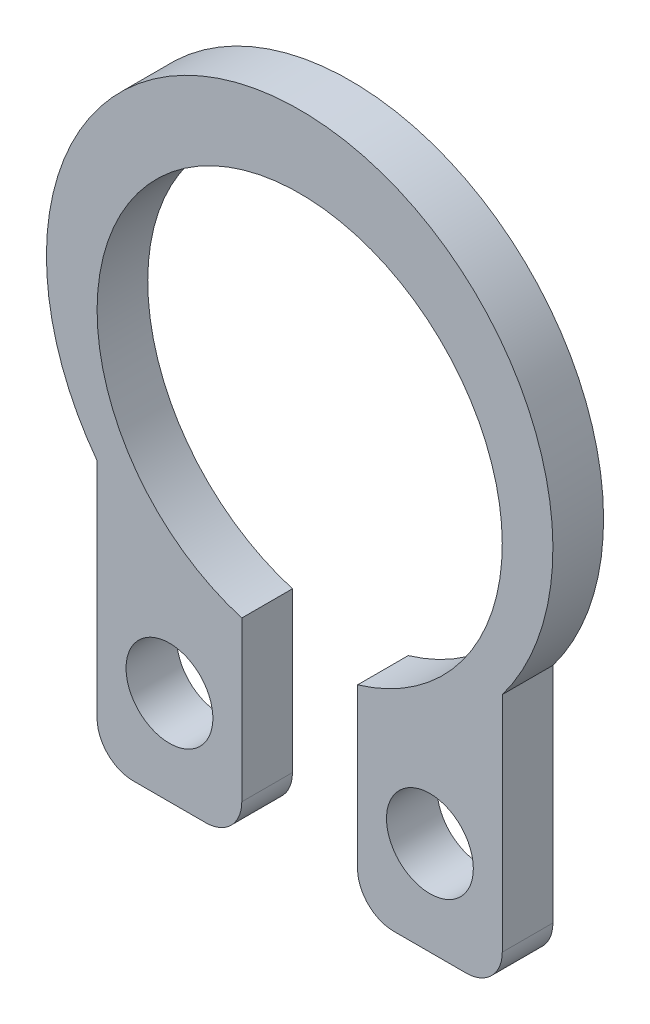
ISO-10303-21;
HEADER;
FILE_DESCRIPTION(('STEP AP214'),'2;1');
FILE_NAME('part.step','',(''),(''),'','','');
FILE_SCHEMA(('AUTOMOTIVE_DESIGN { 1 0 10303 214 1 1 1 1 }'));
ENDSEC;
DATA;
#1=APPLICATION_CONTEXT('core data for automotive mechanical design processes');
#2=APPLICATION_PROTOCOL_DEFINITION('international standard','automotive_design',2000,#1);
#3=PRODUCT_CONTEXT('',#1,'mechanical');
#4=PRODUCT('Part','Part','',(#3));
#5=PRODUCT_RELATED_PRODUCT_CATEGORY('part','',(#4));
#6=PRODUCT_DEFINITION_FORMATION('','',#4);
#7=PRODUCT_DEFINITION_CONTEXT('part definition',#1,'design');
#8=PRODUCT_DEFINITION('design','',#6,#7);
#9=PRODUCT_DEFINITION_SHAPE('','',#8);
#10=(LENGTH_UNIT() NAMED_UNIT(*) SI_UNIT(.MILLI.,.METRE.));
#11=(NAMED_UNIT(*) PLANE_ANGLE_UNIT() SI_UNIT($,.RADIAN.));
#12=(NAMED_UNIT(*) SI_UNIT($,.STERADIAN.) SOLID_ANGLE_UNIT());
#13=UNCERTAINTY_MEASURE_WITH_UNIT(LENGTH_MEASURE(1.E-05),#10,'distance_accuracy_value','');
#14=(GEOMETRIC_REPRESENTATION_CONTEXT(3) GLOBAL_UNCERTAINTY_ASSIGNED_CONTEXT((#13)) GLOBAL_UNIT_ASSIGNED_CONTEXT((#10,
#11,#12)) REPRESENTATION_CONTEXT('',''));
#15=CARTESIAN_POINT('',(0.,0.,0.));
#16=DIRECTION('',(0.,0.,1.));
#17=DIRECTION('',(1.,0.,0.));
#18=AXIS2_PLACEMENT_3D('',#15,#16,#17);
#19=CARTESIAN_POINT('',(0.,0.3,0.7));
#20=DIRECTION('',(0.,0.,1.));
#21=DIRECTION('',(1.,0.,0.));
#22=AXIS2_PLACEMENT_3D('',#19,#20,#21);
#23=PLANE('',#22);
#24=CARTESIAN_POINT('',(1.8,-4.08328157299975,0.7));
#25=DIRECTION('',(0.,0.,1.));
#26=DIRECTION('',(1.,0.,0.));
#27=AXIS2_PLACEMENT_3D('',#24,#25,#26);
#28=CIRCLE('',#27,0.6);
#29=CARTESIAN_POINT('',(2.4,-4.08328157299975,0.7));
#30=VERTEX_POINT('',#29);
#31=EDGE_CURVE('E158',#30,#30,#28,.T.);
#32=ORIENTED_EDGE('',*,*,#31,.F.);
#33=EDGE_LOOP('',(#32));
#34=FACE_BOUND('',#33,.T.);
#35=CARTESIAN_POINT('',(0.,0.3,0.7));
#36=DIRECTION('',(0.,0.,1.));
#37=DIRECTION('',(1.,0.,0.));
#38=AXIS2_PLACEMENT_3D('',#35,#36,#37);
#39=CIRCLE('',#38,3.5);
#40=CARTESIAN_POINT('',(2.8,-1.8,0.7));
#41=VERTEX_POINT('',#40);
#42=CARTESIAN_POINT('',(-2.8,-1.8,0.7));
#43=VERTEX_POINT('',#42);
#44=EDGE_CURVE('E177',#41,#43,#39,.T.);
#45=ORIENTED_EDGE('',*,*,#44,.T.);
#46=DIRECTION('',(0.,-1.,0.));
#47=VECTOR('',#46,1.);
#48=CARTESIAN_POINT('',(-2.8,-4.88328157299975,0.7));
#49=LINE('',#48,#47);
#50=CARTESIAN_POINT('',(-2.8,-4.88328157299975,0.7));
#51=VERTEX_POINT('',#50);
#52=EDGE_CURVE('E105',#43,#51,#49,.T.);
#53=ORIENTED_EDGE('',*,*,#52,.T.);
#54=CARTESIAN_POINT('',(-2.3,-4.88328157299975,0.7));
#55=DIRECTION('',(0.,0.,1.));
#56=DIRECTION('',(-1.,0.,0.));
#57=AXIS2_PLACEMENT_3D('',#54,#55,#56);
#58=CIRCLE('',#57,0.500000000000001);
#59=CARTESIAN_POINT('',(-2.3,-5.38328157299975,0.7));
#60=VERTEX_POINT('',#59);
#61=EDGE_CURVE('E204',#51,#60,#58,.T.);
#62=ORIENTED_EDGE('',*,*,#61,.T.);
#63=DIRECTION('',(1.,0.,0.));
#64=VECTOR('',#63,1.);
#65=CARTESIAN_POINT('',(-1.3,-5.38328157299975,0.7));
#66=LINE('',#65,#64);
#67=CARTESIAN_POINT('',(-1.3,-5.38328157299975,0.7));
#68=VERTEX_POINT('',#67);
#69=EDGE_CURVE('E223',#60,#68,#66,.T.);
#70=ORIENTED_EDGE('',*,*,#69,.T.);
#71=CARTESIAN_POINT('',(-1.3,-4.88328157299975,0.7));
#72=DIRECTION('',(0.,0.,1.));
#73=DIRECTION('',(-1.,0.,0.));
#74=AXIS2_PLACEMENT_3D('',#71,#72,#73);
#75=CIRCLE('',#74,0.500000000000001);
#76=CARTESIAN_POINT('',(-0.800000000000001,-4.88328157299975,0.7));
#77=VERTEX_POINT('',#76);
#78=EDGE_CURVE('E220',#68,#77,#75,.T.);
#79=ORIENTED_EDGE('',*,*,#78,.T.);
#80=DIRECTION('',(0.,1.,0.));
#81=VECTOR('',#80,1.);
#82=CARTESIAN_POINT('',(-0.8,-2.68328157299975,0.7));
#83=LINE('',#82,#81);
#84=CARTESIAN_POINT('',(-0.800000000000001,-2.68328157299975,0.7));
#85=VERTEX_POINT('',#84);
#86=EDGE_CURVE('E222',#77,#85,#83,.T.);
#87=ORIENTED_EDGE('',*,*,#86,.T.);
#88=CARTESIAN_POINT('',(0.,0.,0.7));
#89=DIRECTION('',(0.,0.,-1.));
#90=DIRECTION('',(1.,0.,0.));
#91=AXIS2_PLACEMENT_3D('',#88,#89,#90);
#92=CIRCLE('',#91,2.8);
#93=CARTESIAN_POINT('',(0.8,-2.68328157299975,0.7));
#94=VERTEX_POINT('',#93);
#95=EDGE_CURVE('E225',#85,#94,#92,.T.);
#96=ORIENTED_EDGE('',*,*,#95,.T.);
#97=DIRECTION('',(0.,-1.,0.));
#98=VECTOR('',#97,1.);
#99=CARTESIAN_POINT('',(0.8,-2.68328157299975,0.7));
#100=LINE('',#99,#98);
#101=CARTESIAN_POINT('',(0.8,-4.88328157299975,0.7));
#102=VERTEX_POINT('',#101);
#103=EDGE_CURVE('E231',#94,#102,#100,.T.);
#104=ORIENTED_EDGE('',*,*,#103,.T.);
#105=CARTESIAN_POINT('',(1.3,-4.88328157299975,0.7));
#106=DIRECTION('',(0.,0.,1.));
#107=DIRECTION('',(1.,0.,0.));
#108=AXIS2_PLACEMENT_3D('',#105,#106,#107);
#109=CIRCLE('',#108,0.500000000000001);
#110=CARTESIAN_POINT('',(1.3,-5.38328157299975,0.7));
#111=VERTEX_POINT('',#110);
#112=EDGE_CURVE('E136',#102,#111,#109,.T.);
#113=ORIENTED_EDGE('',*,*,#112,.T.);
#114=DIRECTION('',(1.,0.,0.));
#115=VECTOR('',#114,1.);
#116=CARTESIAN_POINT('',(1.3,-5.38328157299975,0.7));
#117=LINE('',#116,#115);
#118=CARTESIAN_POINT('',(2.3,-5.38328157299975,0.7));
#119=VERTEX_POINT('',#118);
#120=EDGE_CURVE('E130',#111,#119,#117,.T.);
#121=ORIENTED_EDGE('',*,*,#120,.T.);
#122=CARTESIAN_POINT('',(2.3,-4.88328157299975,0.7));
#123=DIRECTION('',(0.,0.,1.));
#124=DIRECTION('',(1.,0.,0.));
#125=AXIS2_PLACEMENT_3D('',#122,#123,#124);
#126=CIRCLE('',#125,0.500000000000001);
#127=CARTESIAN_POINT('',(2.8,-4.88328157299975,0.7));
#128=VERTEX_POINT('',#127);
#129=EDGE_CURVE('E134',#119,#128,#126,.T.);
#130=ORIENTED_EDGE('',*,*,#129,.T.);
#131=DIRECTION('',(0.,1.,0.));
#132=VECTOR('',#131,1.);
#133=CARTESIAN_POINT('',(2.8,-4.88328157299975,0.7));
#134=LINE('',#133,#132);
#135=EDGE_CURVE('E50',#128,#41,#134,.T.);
#136=ORIENTED_EDGE('',*,*,#135,.T.);
#137=EDGE_LOOP('',(#45,#53,#62,#70,#79,#87,#96,#104,#113,#121,#130,#136));
#138=FACE_BOUND('',#137,.T.);
#139=CARTESIAN_POINT('',(-1.8,-4.08328157299975,0.7));
#140=DIRECTION('',(0.,0.,1.));
#141=DIRECTION('',(-1.,0.,0.));
#142=AXIS2_PLACEMENT_3D('',#139,#140,#141);
#143=CIRCLE('',#142,0.6);
#144=CARTESIAN_POINT('',(-2.4,-4.08328157299975,0.7));
#145=VERTEX_POINT('',#144);
#146=EDGE_CURVE('E273',#145,#145,#143,.T.);
#147=ORIENTED_EDGE('',*,*,#146,.F.);
#148=EDGE_LOOP('',(#147));
#149=FACE_BOUND('',#148,.T.);
#150=ADVANCED_FACE('F33',(#34,#138,#149),#23,.T.);
#151=CARTESIAN_POINT('',(0.,0.3,0.));
#152=DIRECTION('',(0.,0.,1.));
#153=DIRECTION('',(1.,0.,0.));
#154=AXIS2_PLACEMENT_3D('',#151,#152,#153);
#155=PLANE('',#154);
#156=CARTESIAN_POINT('',(0.,0.3,0.));
#157=DIRECTION('',(0.,0.,1.));
#158=DIRECTION('',(1.,0.,0.));
#159=AXIS2_PLACEMENT_3D('',#156,#157,#158);
#160=CIRCLE('',#159,3.5);
#161=CARTESIAN_POINT('',(2.8,-1.8,0.));
#162=VERTEX_POINT('',#161);
#163=CARTESIAN_POINT('',(-2.8,-1.8,0.));
#164=VERTEX_POINT('',#163);
#165=EDGE_CURVE('E154',#162,#164,#160,.T.);
#166=ORIENTED_EDGE('',*,*,#165,.F.);
#167=DIRECTION('',(0.,1.,0.));
#168=VECTOR('',#167,1.);
#169=CARTESIAN_POINT('',(2.8,-4.88328157299975,0.));
#170=LINE('',#169,#168);
#171=CARTESIAN_POINT('',(2.8,-4.88328157299975,0.));
#172=VERTEX_POINT('',#171);
#173=EDGE_CURVE('E97',#172,#162,#170,.T.);
#174=ORIENTED_EDGE('',*,*,#173,.F.);
#175=CARTESIAN_POINT('',(2.3,-4.88328157299975,0.));
#176=DIRECTION('',(0.,0.,1.));
#177=DIRECTION('',(1.,0.,0.));
#178=AXIS2_PLACEMENT_3D('',#175,#176,#177);
#179=CIRCLE('',#178,0.500000000000001);
#180=CARTESIAN_POINT('',(2.3,-5.38328157299975,0.));
#181=VERTEX_POINT('',#180);
#182=EDGE_CURVE('E91',#181,#172,#179,.T.);
#183=ORIENTED_EDGE('',*,*,#182,.F.);
#184=DIRECTION('',(1.,0.,0.));
#185=VECTOR('',#184,1.);
#186=CARTESIAN_POINT('',(1.3,-5.38328157299975,0.));
#187=LINE('',#186,#185);
#188=CARTESIAN_POINT('',(1.3,-5.38328157299975,0.));
#189=VERTEX_POINT('',#188);
#190=EDGE_CURVE('E144',#189,#181,#187,.T.);
#191=ORIENTED_EDGE('',*,*,#190,.F.);
#192=CARTESIAN_POINT('',(1.3,-4.88328157299975,0.));
#193=DIRECTION('',(0.,0.,1.));
#194=DIRECTION('',(1.,0.,0.));
#195=AXIS2_PLACEMENT_3D('',#192,#193,#194);
#196=CIRCLE('',#195,0.500000000000001);
#197=CARTESIAN_POINT('',(0.8,-4.88328157299975,0.));
#198=VERTEX_POINT('',#197);
#199=EDGE_CURVE('E172',#198,#189,#196,.T.);
#200=ORIENTED_EDGE('',*,*,#199,.F.);
#201=DIRECTION('',(0.,-1.,0.));
#202=VECTOR('',#201,1.);
#203=CARTESIAN_POINT('',(0.8,-2.68328157299975,0.));
#204=LINE('',#203,#202);
#205=CARTESIAN_POINT('',(0.8,-2.68328157299975,0.));
#206=VERTEX_POINT('',#205);
#207=EDGE_CURVE('E170',#206,#198,#204,.T.);
#208=ORIENTED_EDGE('',*,*,#207,.F.);
#209=CARTESIAN_POINT('',(0.,0.,0.));
#210=DIRECTION('',(0.,0.,-1.));
#211=DIRECTION('',(1.,0.,0.));
#212=AXIS2_PLACEMENT_3D('',#209,#210,#211);
#213=CIRCLE('',#212,2.8);
#214=CARTESIAN_POINT('',(-0.800000000000001,-2.68328157299975,0.));
#215=VERTEX_POINT('',#214);
#216=EDGE_CURVE('E168',#215,#206,#213,.T.);
#217=ORIENTED_EDGE('',*,*,#216,.F.);
#218=DIRECTION('',(0.,1.,0.));
#219=VECTOR('',#218,1.);
#220=CARTESIAN_POINT('',(-0.8,-2.68328157299975,0.));
#221=LINE('',#220,#219);
#222=CARTESIAN_POINT('',(-0.800000000000001,-4.88328157299975,0.));
#223=VERTEX_POINT('',#222);
#224=EDGE_CURVE('E166',#223,#215,#221,.T.);
#225=ORIENTED_EDGE('',*,*,#224,.F.);
#226=CARTESIAN_POINT('',(-1.3,-4.88328157299975,0.));
#227=DIRECTION('',(0.,0.,1.));
#228=DIRECTION('',(-1.,0.,0.));
#229=AXIS2_PLACEMENT_3D('',#226,#227,#228);
#230=CIRCLE('',#229,0.500000000000001);
#231=CARTESIAN_POINT('',(-1.3,-5.38328157299975,0.));
#232=VERTEX_POINT('',#231);
#233=EDGE_CURVE('E164',#232,#223,#230,.T.);
#234=ORIENTED_EDGE('',*,*,#233,.F.);
#235=DIRECTION('',(1.,0.,0.));
#236=VECTOR('',#235,1.);
#237=CARTESIAN_POINT('',(-1.3,-5.38328157299975,0.));
#238=LINE('',#237,#236);
#239=CARTESIAN_POINT('',(-2.3,-5.38328157299975,0.));
#240=VERTEX_POINT('',#239);
#241=EDGE_CURVE('E162',#240,#232,#238,.T.);
#242=ORIENTED_EDGE('',*,*,#241,.F.);
#243=CARTESIAN_POINT('',(-2.3,-4.88328157299975,0.));
#244=DIRECTION('',(0.,0.,1.));
#245=DIRECTION('',(-1.,0.,0.));
#246=AXIS2_PLACEMENT_3D('',#243,#244,#245);
#247=CIRCLE('',#246,0.500000000000001);
#248=CARTESIAN_POINT('',(-2.8,-4.88328157299975,0.));
#249=VERTEX_POINT('',#248);
#250=EDGE_CURVE('E160',#249,#240,#247,.T.);
#251=ORIENTED_EDGE('',*,*,#250,.F.);
#252=DIRECTION('',(0.,-1.,0.));
#253=VECTOR('',#252,1.);
#254=CARTESIAN_POINT('',(-2.8,-4.88328157299975,0.));
#255=LINE('',#254,#253);
#256=EDGE_CURVE('E157',#164,#249,#255,.T.);
#257=ORIENTED_EDGE('',*,*,#256,.F.);
#258=EDGE_LOOP('',(#166,#174,#183,#191,#200,#208,#217,#225,#234,#242,#251,#257));
#259=FACE_BOUND('',#258,.T.);
#260=CARTESIAN_POINT('',(1.8,-4.08328157299975,0.));
#261=DIRECTION('',(0.,0.,1.));
#262=DIRECTION('',(1.,0.,0.));
#263=AXIS2_PLACEMENT_3D('',#260,#261,#262);
#264=CIRCLE('',#263,0.6);
#265=CARTESIAN_POINT('',(2.4,-4.08328157299975,0.));
#266=VERTEX_POINT('',#265);
#267=EDGE_CURVE('E279',#266,#266,#264,.T.);
#268=ORIENTED_EDGE('',*,*,#267,.T.);
#269=EDGE_LOOP('',(#268));
#270=FACE_BOUND('',#269,.T.);
#271=CARTESIAN_POINT('',(-1.8,-4.08328157299975,0.));
#272=DIRECTION('',(0.,0.,1.));
#273=DIRECTION('',(-1.,0.,0.));
#274=AXIS2_PLACEMENT_3D('',#271,#272,#273);
#275=CIRCLE('',#274,0.6);
#276=CARTESIAN_POINT('',(-2.4,-4.08328157299975,0.));
#277=VERTEX_POINT('',#276);
#278=EDGE_CURVE('E276',#277,#277,#275,.T.);
#279=ORIENTED_EDGE('',*,*,#278,.T.);
#280=EDGE_LOOP('',(#279));
#281=FACE_BOUND('',#280,.T.);
#282=ADVANCED_FACE('F208',(#259,#270,#281),#155,.F.);
#283=CARTESIAN_POINT('',(0.,0.3,0.7));
#284=DIRECTION('',(0.,0.,-1.));
#285=DIRECTION('',(-1.,0.,0.));
#286=AXIS2_PLACEMENT_3D('',#283,#284,#285);
#287=CYLINDRICAL_SURFACE('',#286,3.5);
#288=ORIENTED_EDGE('',*,*,#165,.T.);
#289=DIRECTION('',(0.,0.,-1.));
#290=VECTOR('',#289,1.);
#291=CARTESIAN_POINT('',(-2.8,-1.8,0.7));
#292=LINE('',#291,#290);
#293=EDGE_CURVE('E11',#43,#164,#292,.T.);
#294=ORIENTED_EDGE('',*,*,#293,.F.);
#295=ORIENTED_EDGE('',*,*,#44,.F.);
#296=DIRECTION('',(0.,0.,-1.));
#297=VECTOR('',#296,1.);
#298=CARTESIAN_POINT('',(2.8,-1.8,0.7));
#299=LINE('',#298,#297);
#300=EDGE_CURVE('E150',#41,#162,#299,.T.);
#301=ORIENTED_EDGE('',*,*,#300,.T.);
#302=EDGE_LOOP('',(#288,#294,#295,#301));
#303=FACE_BOUND('',#302,.T.);
#304=ADVANCED_FACE('F35',(#303),#287,.T.);
#305=CARTESIAN_POINT('',(-2.8,-4.88328157299975,0.7));
#306=DIRECTION('',(1.,0.,0.));
#307=DIRECTION('',(0.,0.,-1.));
#308=AXIS2_PLACEMENT_3D('',#305,#306,#307);
#309=PLANE('',#308);
#310=ORIENTED_EDGE('',*,*,#256,.T.);
#311=DIRECTION('',(0.,0.,-1.));
#312=VECTOR('',#311,1.);
#313=CARTESIAN_POINT('',(-2.8,-4.88328157299975,0.7));
#314=LINE('',#313,#312);
#315=EDGE_CURVE('E42',#51,#249,#314,.T.);
#316=ORIENTED_EDGE('',*,*,#315,.F.);
#317=ORIENTED_EDGE('',*,*,#52,.F.);
#318=ORIENTED_EDGE('',*,*,#293,.T.);
#319=EDGE_LOOP('',(#310,#316,#317,#318));
#320=FACE_BOUND('',#319,.T.);
#321=ADVANCED_FACE('F372',(#320),#309,.F.);
#322=CARTESIAN_POINT('',(-2.3,-4.88328157299975,0.7));
#323=DIRECTION('',(0.,0.,-1.));
#324=DIRECTION('',(-1.,0.,0.));
#325=AXIS2_PLACEMENT_3D('',#322,#323,#324);
#326=CYLINDRICAL_SURFACE('',#325,0.500000000000001);
#327=ORIENTED_EDGE('',*,*,#250,.T.);
#328=DIRECTION('',(0.,0.,-1.));
#329=VECTOR('',#328,1.);
#330=CARTESIAN_POINT('',(-2.3,-5.38328157299975,0.7));
#331=LINE('',#330,#329);
#332=EDGE_CURVE('E196',#60,#240,#331,.T.);
#333=ORIENTED_EDGE('',*,*,#332,.F.);
#334=ORIENTED_EDGE('',*,*,#61,.F.);
#335=ORIENTED_EDGE('',*,*,#315,.T.);
#336=EDGE_LOOP('',(#327,#333,#334,#335));
#337=FACE_BOUND('',#336,.T.);
#338=ADVANCED_FACE('F202',(#337),#326,.T.);
#339=CARTESIAN_POINT('',(-1.3,-5.38328157299975,0.7));
#340=DIRECTION('',(0.,1.,0.));
#341=DIRECTION('',(0.,0.,1.));
#342=AXIS2_PLACEMENT_3D('',#339,#340,#341);
#343=PLANE('',#342);
#344=ORIENTED_EDGE('',*,*,#241,.T.);
#345=DIRECTION('',(0.,0.,-1.));
#346=VECTOR('',#345,1.);
#347=CARTESIAN_POINT('',(-1.3,-5.38328157299975,0.7));
#348=LINE('',#347,#346);
#349=EDGE_CURVE('E193',#68,#232,#348,.T.);
#350=ORIENTED_EDGE('',*,*,#349,.F.);
#351=ORIENTED_EDGE('',*,*,#69,.F.);
#352=ORIENTED_EDGE('',*,*,#332,.T.);
#353=EDGE_LOOP('',(#344,#350,#351,#352));
#354=FACE_BOUND('',#353,.T.);
#355=ADVANCED_FACE('F214',(#354),#343,.F.);
#356=CARTESIAN_POINT('',(-1.3,-4.88328157299975,0.7));
#357=DIRECTION('',(0.,0.,-1.));
#358=DIRECTION('',(-1.,0.,0.));
#359=AXIS2_PLACEMENT_3D('',#356,#357,#358);
#360=CYLINDRICAL_SURFACE('',#359,0.500000000000001);
#361=ORIENTED_EDGE('',*,*,#233,.T.);
#362=DIRECTION('',(0.,0.,-1.));
#363=VECTOR('',#362,1.);
#364=CARTESIAN_POINT('',(-0.800000000000001,-4.88328157299975,0.7));
#365=LINE('',#364,#363);
#366=EDGE_CURVE('E190',#77,#223,#365,.T.);
#367=ORIENTED_EDGE('',*,*,#366,.F.);
#368=ORIENTED_EDGE('',*,*,#78,.F.);
#369=ORIENTED_EDGE('',*,*,#349,.T.);
#370=EDGE_LOOP('',(#361,#367,#368,#369));
#371=FACE_BOUND('',#370,.T.);
#372=ADVANCED_FACE('F218',(#371),#360,.T.);
#373=CARTESIAN_POINT('',(-0.8,-2.68328157299975,0.7));
#374=DIRECTION('',(-1.,0.,0.));
#375=DIRECTION('',(0.,-1.,0.));
#376=AXIS2_PLACEMENT_3D('',#373,#374,#375);
#377=PLANE('',#376);
#378=ORIENTED_EDGE('',*,*,#224,.T.);
#379=DIRECTION('',(0.,0.,-1.));
#380=VECTOR('',#379,1.);
#381=CARTESIAN_POINT('',(-0.800000000000001,-2.68328157299975,0.7));
#382=LINE('',#381,#380);
#383=EDGE_CURVE('E187',#85,#215,#382,.T.);
#384=ORIENTED_EDGE('',*,*,#383,.F.);
#385=ORIENTED_EDGE('',*,*,#86,.F.);
#386=ORIENTED_EDGE('',*,*,#366,.T.);
#387=EDGE_LOOP('',(#378,#384,#385,#386));
#388=FACE_BOUND('',#387,.T.);
#389=ADVANCED_FACE('F337',(#388),#377,.F.);
#390=CARTESIAN_POINT('',(0.,0.,0.7));
#391=DIRECTION('',(0.,0.,-1.));
#392=DIRECTION('',(-1.,0.,0.));
#393=AXIS2_PLACEMENT_3D('',#390,#391,#392);
#394=CYLINDRICAL_SURFACE('',#393,2.8);
#395=ORIENTED_EDGE('',*,*,#216,.T.);
#396=DIRECTION('',(0.,0.,-1.));
#397=VECTOR('',#396,1.);
#398=CARTESIAN_POINT('',(0.8,-2.68328157299975,0.7));
#399=LINE('',#398,#397);
#400=EDGE_CURVE('E184',#94,#206,#399,.T.);
#401=ORIENTED_EDGE('',*,*,#400,.F.);
#402=ORIENTED_EDGE('',*,*,#95,.F.);
#403=ORIENTED_EDGE('',*,*,#383,.T.);
#404=EDGE_LOOP('',(#395,#401,#402,#403));
#405=FACE_BOUND('',#404,.T.);
#406=ADVANCED_FACE('F328',(#405),#394,.F.);
#407=CARTESIAN_POINT('',(0.8,-2.68328157299975,0.7));
#408=DIRECTION('',(1.,0.,0.));
#409=DIRECTION('',(0.,1.,0.));
#410=AXIS2_PLACEMENT_3D('',#407,#408,#409);
#411=PLANE('',#410);
#412=ORIENTED_EDGE('',*,*,#207,.T.);
#413=DIRECTION('',(0.,0.,-1.));
#414=VECTOR('',#413,1.);
#415=CARTESIAN_POINT('',(0.8,-4.88328157299975,0.7));
#416=LINE('',#415,#414);
#417=EDGE_CURVE('E181',#102,#198,#416,.T.);
#418=ORIENTED_EDGE('',*,*,#417,.F.);
#419=ORIENTED_EDGE('',*,*,#103,.F.);
#420=ORIENTED_EDGE('',*,*,#400,.T.);
#421=EDGE_LOOP('',(#412,#418,#419,#420));
#422=FACE_BOUND('',#421,.T.);
#423=ADVANCED_FACE('F237',(#422),#411,.F.);
#424=CARTESIAN_POINT('',(1.3,-4.88328157299975,0.7));
#425=DIRECTION('',(0.,0.,-1.));
#426=DIRECTION('',(-1.,0.,0.));
#427=AXIS2_PLACEMENT_3D('',#424,#425,#426);
#428=CYLINDRICAL_SURFACE('',#427,0.500000000000001);
#429=ORIENTED_EDGE('',*,*,#199,.T.);
#430=DIRECTION('',(0.,0.,-1.));
#431=VECTOR('',#430,1.);
#432=CARTESIAN_POINT('',(1.3,-5.38328157299975,0.7));
#433=LINE('',#432,#431);
#434=EDGE_CURVE('E145',#111,#189,#433,.T.);
#435=ORIENTED_EDGE('',*,*,#434,.F.);
#436=ORIENTED_EDGE('',*,*,#112,.F.);
#437=ORIENTED_EDGE('',*,*,#417,.T.);
#438=EDGE_LOOP('',(#429,#435,#436,#437));
#439=FACE_BOUND('',#438,.T.);
#440=ADVANCED_FACE('F241',(#439),#428,.T.);
#441=CARTESIAN_POINT('',(1.3,-5.38328157299975,0.7));
#442=DIRECTION('',(0.,1.,0.));
#443=DIRECTION('',(0.,0.,1.));
#444=AXIS2_PLACEMENT_3D('',#441,#442,#443);
#445=PLANE('',#444);
#446=ORIENTED_EDGE('',*,*,#190,.T.);
#447=DIRECTION('',(0.,0.,-1.));
#448=VECTOR('',#447,1.);
#449=CARTESIAN_POINT('',(2.3,-5.38328157299975,0.7));
#450=LINE('',#449,#448);
#451=EDGE_CURVE('E141',#119,#181,#450,.T.);
#452=ORIENTED_EDGE('',*,*,#451,.F.);
#453=ORIENTED_EDGE('',*,*,#120,.F.);
#454=ORIENTED_EDGE('',*,*,#434,.T.);
#455=EDGE_LOOP('',(#446,#452,#453,#454));
#456=FACE_BOUND('',#455,.T.);
#457=ADVANCED_FACE('F142',(#456),#445,.F.);
#458=CARTESIAN_POINT('',(2.3,-4.88328157299975,0.7));
#459=DIRECTION('',(0.,0.,-1.));
#460=DIRECTION('',(-1.,0.,0.));
#461=AXIS2_PLACEMENT_3D('',#458,#459,#460);
#462=CYLINDRICAL_SURFACE('',#461,0.500000000000001);
#463=ORIENTED_EDGE('',*,*,#182,.T.);
#464=DIRECTION('',(0.,0.,-1.));
#465=VECTOR('',#464,1.);
#466=CARTESIAN_POINT('',(2.8,-4.88328157299975,0.7));
#467=LINE('',#466,#465);
#468=EDGE_CURVE('E146',#128,#172,#467,.T.);
#469=ORIENTED_EDGE('',*,*,#468,.F.);
#470=ORIENTED_EDGE('',*,*,#129,.F.);
#471=ORIENTED_EDGE('',*,*,#451,.T.);
#472=EDGE_LOOP('',(#463,#469,#470,#471));
#473=FACE_BOUND('',#472,.T.);
#474=ADVANCED_FACE('F148',(#473),#462,.T.);
#475=CARTESIAN_POINT('',(2.8,-4.88328157299975,0.7));
#476=DIRECTION('',(-1.,0.,0.));
#477=DIRECTION('',(0.,0.,1.));
#478=AXIS2_PLACEMENT_3D('',#475,#476,#477);
#479=PLANE('',#478);
#480=ORIENTED_EDGE('',*,*,#173,.T.);
#481=ORIENTED_EDGE('',*,*,#300,.F.);
#482=ORIENTED_EDGE('',*,*,#135,.F.);
#483=ORIENTED_EDGE('',*,*,#468,.T.);
#484=EDGE_LOOP('',(#480,#481,#482,#483));
#485=FACE_BOUND('',#484,.T.);
#486=ADVANCED_FACE('F245',(#485),#479,.F.);
#487=CARTESIAN_POINT('',(1.8,-4.08328157299975,0.7));
#488=DIRECTION('',(0.,0.,-1.));
#489=DIRECTION('',(-1.,0.,0.));
#490=AXIS2_PLACEMENT_3D('',#487,#488,#489);
#491=CYLINDRICAL_SURFACE('',#490,0.6);
#492=ORIENTED_EDGE('',*,*,#31,.T.);
#493=EDGE_LOOP('',(#492));
#494=FACE_BOUND('',#493,.T.);
#495=ORIENTED_EDGE('',*,*,#267,.F.);
#496=EDGE_LOOP('',(#495));
#497=FACE_BOUND('',#496,.T.);
#498=ADVANCED_FACE('F247',(#494,#497),#491,.F.);
#499=CARTESIAN_POINT('',(-1.8,-4.08328157299975,0.7));
#500=DIRECTION('',(0.,0.,-1.));
#501=DIRECTION('',(-1.,0.,0.));
#502=AXIS2_PLACEMENT_3D('',#499,#500,#501);
#503=CYLINDRICAL_SURFACE('',#502,0.6);
#504=ORIENTED_EDGE('',*,*,#146,.T.);
#505=EDGE_LOOP('',(#504));
#506=FACE_BOUND('',#505,.T.);
#507=ORIENTED_EDGE('',*,*,#278,.F.);
#508=EDGE_LOOP('',(#507));
#509=FACE_BOUND('',#508,.T.);
#510=ADVANCED_FACE('F253',(#506,#509),#503,.F.);
#511=CLOSED_SHELL('',(#150,#282,#304,#321,#338,#355,#372,#389,#406,#423,#440,#457,#474,#486,
#498,#510));
#512=MANIFOLD_SOLID_BREP('B2',#511);
#513=ADVANCED_BREP_SHAPE_REPRESENTATION('',(#18,#512),#14);
#514=SHAPE_DEFINITION_REPRESENTATION(#9,#513);
ENDSEC;
END-ISO-10303-21;
